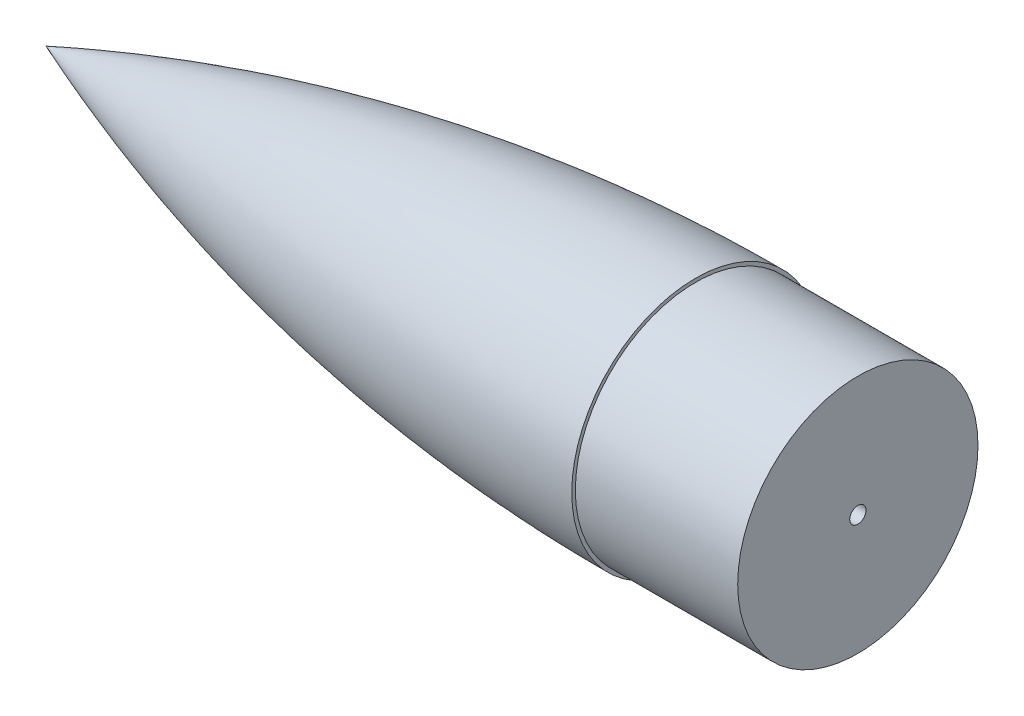
ISO-10303-21;
HEADER;
FILE_DESCRIPTION(('STEP AP214'),'2;1');
FILE_NAME('part.step','',(''),(''),'','','');
FILE_SCHEMA(('AUTOMOTIVE_DESIGN { 1 0 10303 214 1 1 1 1 }'));
ENDSEC;
DATA;
#1=APPLICATION_CONTEXT('core data for automotive mechanical design processes');
#2=APPLICATION_PROTOCOL_DEFINITION('international standard','automotive_design',2000,#1);
#3=PRODUCT_CONTEXT('',#1,'mechanical');
#4=PRODUCT('Part','Part','',(#3));
#5=PRODUCT_RELATED_PRODUCT_CATEGORY('part','',(#4));
#6=PRODUCT_DEFINITION_FORMATION('','',#4);
#7=PRODUCT_DEFINITION_CONTEXT('part definition',#1,'design');
#8=PRODUCT_DEFINITION('design','',#6,#7);
#9=PRODUCT_DEFINITION_SHAPE('','',#8);
#10=(LENGTH_UNIT() NAMED_UNIT(*) SI_UNIT(.MILLI.,.METRE.));
#11=(NAMED_UNIT(*) PLANE_ANGLE_UNIT() SI_UNIT($,.RADIAN.));
#12=(NAMED_UNIT(*) SI_UNIT($,.STERADIAN.) SOLID_ANGLE_UNIT());
#13=UNCERTAINTY_MEASURE_WITH_UNIT(LENGTH_MEASURE(1.E-05),#10,'distance_accuracy_value','');
#14=(GEOMETRIC_REPRESENTATION_CONTEXT(3) GLOBAL_UNCERTAINTY_ASSIGNED_CONTEXT((#13)) GLOBAL_UNIT_ASSIGNED_CONTEXT((#10,
#11,#12)) REPRESENTATION_CONTEXT('',''));
#15=CARTESIAN_POINT('',(0.,0.,0.));
#16=DIRECTION('',(0.,0.,1.));
#17=DIRECTION('',(1.,0.,0.));
#18=AXIS2_PLACEMENT_3D('',#15,#16,#17);
#19=CARTESIAN_POINT('',(200.,0.,0.));
#20=DIRECTION('',(-1.,0.,0.));
#21=DIRECTION('',(0.,0.,1.));
#22=AXIS2_PLACEMENT_3D('',#19,#20,#21);
#23=PLANE('',#22);
#24=CARTESIAN_POINT('',(200.,0.,0.));
#25=DIRECTION('',(-1.,0.,0.));
#26=DIRECTION('',(0.,0.,1.));
#27=AXIS2_PLACEMENT_3D('',#24,#25,#26);
#28=CIRCLE('',#27,37.);
#29=CARTESIAN_POINT('',(200.,0.,37.));
#30=VERTEX_POINT('',#29);
#31=EDGE_CURVE('E11',#30,#30,#28,.F.);
#32=ORIENTED_EDGE('',*,*,#31,.F.);
#33=EDGE_LOOP('',(#32));
#34=FACE_BOUND('',#33,.T.);
#35=CARTESIAN_POINT('',(200.,0.,0.));
#36=DIRECTION('',(-1.,0.,0.));
#37=DIRECTION('',(0.,0.,1.));
#38=AXIS2_PLACEMENT_3D('',#35,#36,#37);
#39=CIRCLE('',#38,38.1);
#40=CARTESIAN_POINT('',(200.,0.,38.1));
#41=VERTEX_POINT('',#40);
#42=EDGE_CURVE('E49',#41,#41,#39,.T.);
#43=ORIENTED_EDGE('',*,*,#42,.F.);
#44=EDGE_LOOP('',(#43));
#45=FACE_BOUND('',#44,.T.);
#46=ADVANCED_FACE('F43',(#34,#45),#23,.F.);
#47=CARTESIAN_POINT('',(200.,38.1,0.));
#48=CARTESIAN_POINT('',(199.666666478581,38.0998232660269,0.));
#49=CARTESIAN_POINT('',(198.999998308743,38.0994697974832,0.));
#50=CARTESIAN_POINT('',(197.999996624831,38.0966067902377,0.));
#51=CARTESIAN_POINT('',(196.999994924003,38.0920409643626,0.));
#52=CARTESIAN_POINT('',(195.999993248367,38.085597182683,0.));
#53=CARTESIAN_POINT('',(194.333291829067,38.0718149553696,0.));
#54=CARTESIAN_POINT('',(190.666251166407,38.0279937545519,0.));
#55=CARTESIAN_POINT('',(186.332724984721,37.9363536658674,0.));
#56=CARTESIAN_POINT('',(176.66104005135,37.6428696266519,0.));
#57=CARTESIAN_POINT('',(166.989872455992,37.1532595430564,0.));
#58=CARTESIAN_POINT('',(156.997734152836,36.4072421819354,0.));
#59=CARTESIAN_POINT('',(150.663527404361,35.8696911783221,0.));
#60=CARTESIAN_POINT('',(141.318339795493,34.9722406398491,0.));
#61=CARTESIAN_POINT('',(132.989549920129,33.9853979018677,0.));
#62=CARTESIAN_POINT('',(124.997544262646,32.9106601777412,0.));
#63=CARTESIAN_POINT('',(118.320286797656,31.9622020423482,0.));
#64=CARTESIAN_POINT('',(109.652181507163,30.5742971062107,0.));
#65=CARTESIAN_POINT('',(99.9872261179373,28.8507386770299,0.));
#66=CARTESIAN_POINT('',(93.3246570379348,27.5529885791243,0.));
#67=CARTESIAN_POINT('',(87.3300839150212,26.3093658927679,0.));
#68=CARTESIAN_POINT('',(83.9973315582262,25.5917966783319,0.));
#69=CARTESIAN_POINT('',(78.993971116973,24.4799982636738,0.));
#70=CARTESIAN_POINT('',(73.9903306882384,23.3185217446525,0.));
#71=CARTESIAN_POINT('',(68.6628202765523,22.0126992595714,0.));
#72=CARTESIAN_POINT('',(64.3293380582669,20.9156666961443,0.));
#73=CARTESIAN_POINT('',(59.9936678136376,19.782959155866,0.));
#74=CARTESIAN_POINT('',(54.6586423094138,18.3348380568415,0.));
#75=CARTESIAN_POINT('',(44.6178095573701,15.4959258877362,0.));
#76=CARTESIAN_POINT('',(32.5948641338404,11.7826664319626,0.));
#77=CARTESIAN_POINT('',(21.6483659144328,8.0513554499034,0.));
#78=CARTESIAN_POINT('',(15.3275679514531,5.80034684709306,0.));
#79=CARTESIAN_POINT('',(11.3259692269917,4.33989664526936,0.));
#80=CARTESIAN_POINT('',(7.32874184729794,2.84098575609211,0.));
#81=CARTESIAN_POINT('',(4.66502861033515,1.82114875262803,0.));
#82=CARTESIAN_POINT('',(2.99961437663014,1.17601578045425,0.));
#83=CARTESIAN_POINT('',(1.99962369173545,0.786334891400863,0.));
#84=CARTESIAN_POINT('',(0.999577038552354,0.394520549324588,0.));
#85=CARTESIAN_POINT('',(0.333278549188721,0.131540873022114,0.));
#86=CARTESIAN_POINT('',(0.,0.,0.));
#87=B_SPLINE_CURVE_WITH_KNOTS('',3,(#47,#48,#49,#50,#51,#52,#53,#54,#55,#56,#57,#58,#59,#60,#61,
#62,#63,#64,#65,#66,#67,#68,#69,#70,#71,#72,#73,#74,#75,#76,#77,#78,#79,#80,#81,#82,#83,#84,#85,
#86),.UNSPECIFIED.,.F.,.F.,(4,1,1,1,1,1,1,1,1,1,1,1,1,1,1,1,1,1,1,1,1,1,1,1,1,1,1,1,1,1,1,1,1,1,
1,1,1,4),(0.,0.0048827171550343,0.00976545081850089,0.0146482174582725,0.0195310336451093,
0.0244139157877037,0.0390631233678159,0.0732500006347631,0.0879049053211197,0.180800020976286,
0.215074384605198,0.234675493025288,0.27391727328372,0.352590056323854,0.357516722614551,
0.392039049332803,0.451379179611656,0.486097647247001,0.535843160994206,0.55080321974889,
0.575776358939845,0.585779982844259,0.625880659680204,0.651016986866759,0.666127239206161,
0.691360295226432,0.716657357401955,0.747102273597224,0.844203099351644,0.900948589050243,
0.916497928091237,0.942486724875356,0.963345678001197,0.979030708914967,0.98426698153619,
0.989507268068445,0.994751597773372,1.),.UNSPECIFIED.);
#88=CARTESIAN_POINT('',(0.,0.,0.));
#89=DIRECTION('',(-1.,0.,0.));
#90=AXIS1_PLACEMENT('',#88,#89);
#91=SURFACE_OF_REVOLUTION('',#87,#90);
#92=CARTESIAN_POINT('',(0.,0.,0.));
#93=VERTEX_POINT('',#92);
#94=VERTEX_LOOP('',#93);
#95=FACE_BOUND('',#94,.T.);
#96=ORIENTED_EDGE('',*,*,#42,.T.);
#97=EDGE_LOOP('',(#96));
#98=FACE_BOUND('',#97,.T.);
#99=ADVANCED_FACE('F52',(#95,#98),#91,.T.);
#100=CARTESIAN_POINT('',(250.,0.,0.));
#101=DIRECTION('',(-1.,0.,0.));
#102=DIRECTION('',(0.,0.,1.));
#103=AXIS2_PLACEMENT_3D('',#100,#101,#102);
#104=CYLINDRICAL_SURFACE('',#103,37.);
#105=CARTESIAN_POINT('',(250.,0.,0.));
#106=DIRECTION('',(1.,0.,0.));
#107=DIRECTION('',(0.,0.,-1.));
#108=AXIS2_PLACEMENT_3D('',#105,#106,#107);
#109=CIRCLE('',#108,37.);
#110=CARTESIAN_POINT('',(250.,0.,-37.));
#111=VERTEX_POINT('',#110);
#112=EDGE_CURVE('E59',#111,#111,#109,.T.);
#113=ORIENTED_EDGE('',*,*,#112,.F.);
#114=EDGE_LOOP('',(#113));
#115=FACE_BOUND('',#114,.T.);
#116=ORIENTED_EDGE('',*,*,#31,.T.);
#117=EDGE_LOOP('',(#116));
#118=FACE_BOUND('',#117,.T.);
#119=ADVANCED_FACE('F55',(#115,#118),#104,.T.);
#120=CARTESIAN_POINT('',(250.,0.,0.));
#121=DIRECTION('',(1.,0.,0.));
#122=DIRECTION('',(0.,0.,-1.));
#123=AXIS2_PLACEMENT_3D('',#120,#121,#122);
#124=PLANE('',#123);
#125=CARTESIAN_POINT('',(250.,0.,0.));
#126=DIRECTION('',(1.,0.,0.));
#127=DIRECTION('',(0.,0.,-1.));
#128=AXIS2_PLACEMENT_3D('',#125,#126,#127);
#129=CIRCLE('',#128,2.5);
#130=CARTESIAN_POINT('',(250.,0.,-2.5));
#131=VERTEX_POINT('',#130);
#132=EDGE_CURVE('E128',#131,#131,#129,.T.);
#133=ORIENTED_EDGE('',*,*,#132,.F.);
#134=EDGE_LOOP('',(#133));
#135=FACE_BOUND('',#134,.T.);
#136=ORIENTED_EDGE('',*,*,#112,.T.);
#137=EDGE_LOOP('',(#136));
#138=FACE_BOUND('',#137,.T.);
#139=ADVANCED_FACE('F74',(#135,#138),#124,.T.);
#140=CARTESIAN_POINT('',(225.,0.,0.));
#141=DIRECTION('',(1.,0.,0.));
#142=DIRECTION('',(0.,0.,-1.));
#143=AXIS2_PLACEMENT_3D('',#140,#141,#142);
#144=CYLINDRICAL_SURFACE('',#143,2.5);
#145=CARTESIAN_POINT('',(225.,0.,0.));
#146=DIRECTION('',(1.,0.,0.));
#147=DIRECTION('',(0.,0.,-1.));
#148=AXIS2_PLACEMENT_3D('',#145,#146,#147);
#149=CIRCLE('',#148,2.5);
#150=CARTESIAN_POINT('',(225.,0.,-2.5));
#151=VERTEX_POINT('',#150);
#152=EDGE_CURVE('E61',#151,#151,#149,.T.);
#153=ORIENTED_EDGE('',*,*,#152,.F.);
#154=EDGE_LOOP('',(#153));
#155=FACE_BOUND('',#154,.T.);
#156=ORIENTED_EDGE('',*,*,#132,.T.);
#157=EDGE_LOOP('',(#156));
#158=FACE_BOUND('',#157,.T.);
#159=ADVANCED_FACE('F78',(#155,#158),#144,.F.);
#160=CARTESIAN_POINT('',(225.,0.,0.));
#161=DIRECTION('',(1.,0.,0.));
#162=DIRECTION('',(0.,0.,-1.));
#163=AXIS2_PLACEMENT_3D('',#160,#161,#162);
#164=PLANE('',#163);
#165=ORIENTED_EDGE('',*,*,#152,.T.);
#166=EDGE_LOOP('',(#165));
#167=FACE_BOUND('',#166,.T.);
#168=ADVANCED_FACE('F82',(#167),#164,.T.);
#169=CLOSED_SHELL('',(#46,#99,#119,#139,#159,#168));
#170=MANIFOLD_SOLID_BREP('B2',#169);
#171=ADVANCED_BREP_SHAPE_REPRESENTATION('',(#18,#170),#14);
#172=SHAPE_DEFINITION_REPRESENTATION(#9,#171);
ENDSEC;
END-ISO-10303-21;
